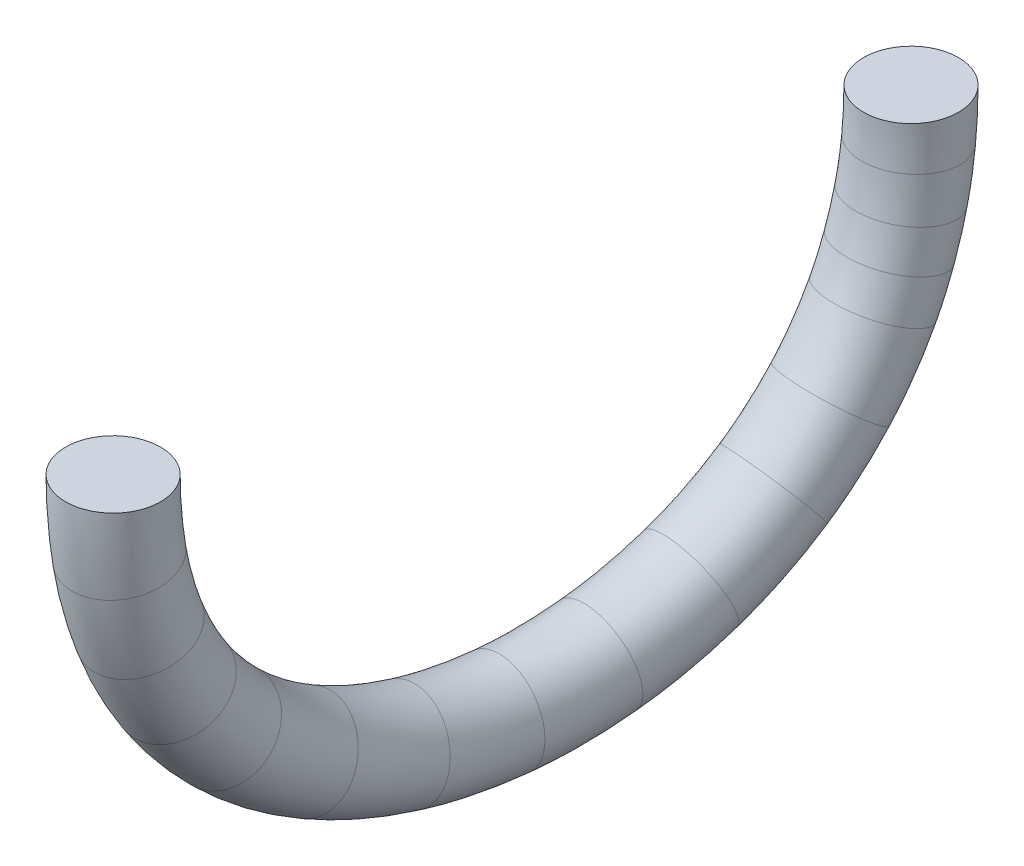
ISO-10303-21;
HEADER;
FILE_DESCRIPTION(('STEP AP214'),'2;1');
FILE_NAME('part.step','',(''),(''),'','','');
FILE_SCHEMA(('AUTOMOTIVE_DESIGN { 1 0 10303 214 1 1 1 1 }'));
ENDSEC;
DATA;
#1=APPLICATION_CONTEXT('core data for automotive mechanical design processes');
#2=APPLICATION_PROTOCOL_DEFINITION('international standard','automotive_design',2000,#1);
#3=PRODUCT_CONTEXT('',#1,'mechanical');
#4=PRODUCT('Part','Part','',(#3));
#5=PRODUCT_RELATED_PRODUCT_CATEGORY('part','',(#4));
#6=PRODUCT_DEFINITION_FORMATION('','',#4);
#7=PRODUCT_DEFINITION_CONTEXT('part definition',#1,'design');
#8=PRODUCT_DEFINITION('design','',#6,#7);
#9=PRODUCT_DEFINITION_SHAPE('','',#8);
#10=(LENGTH_UNIT() NAMED_UNIT(*) SI_UNIT(.MILLI.,.METRE.));
#11=(NAMED_UNIT(*) PLANE_ANGLE_UNIT() SI_UNIT($,.RADIAN.));
#12=(NAMED_UNIT(*) SI_UNIT($,.STERADIAN.) SOLID_ANGLE_UNIT());
#13=UNCERTAINTY_MEASURE_WITH_UNIT(LENGTH_MEASURE(1.E-05),#10,'distance_accuracy_value','');
#14=(GEOMETRIC_REPRESENTATION_CONTEXT(3) GLOBAL_UNCERTAINTY_ASSIGNED_CONTEXT((#13)) GLOBAL_UNIT_ASSIGNED_CONTEXT((#10,
#11,#12)) REPRESENTATION_CONTEXT('',''));
#15=CARTESIAN_POINT('',(0.,0.,0.));
#16=DIRECTION('',(0.,0.,1.));
#17=DIRECTION('',(1.,0.,0.));
#18=AXIS2_PLACEMENT_3D('',#15,#16,#17);
#19=CARTESIAN_POINT('',(3.74968353162511,-227.95,220.010489149716));
#20=DIRECTION('',(0.,-1.,0.));
#21=DIRECTION('',(0.,0.,-1.));
#22=AXIS2_PLACEMENT_3D('',#19,#20,#21);
#23=PLANE('',#22);
#24=CARTESIAN_POINT('',(3.74968353162511,-227.95,220.010489149716));
#25=DIRECTION('',(0.,1.,0.));
#26=DIRECTION('',(0.,0.,-1.));
#27=AXIS2_PLACEMENT_3D('',#24,#25,#26);
#28=CIRCLE('',#27,0.77);
#29=CARTESIAN_POINT('',(3.74968353162511,-227.95,219.240489149716));
#30=VERTEX_POINT('',#29);
#31=EDGE_CURVE('E11',#30,#30,#28,.T.);
#32=ORIENTED_EDGE('',*,*,#31,.T.);
#33=EDGE_LOOP('',(#32));
#34=FACE_BOUND('',#33,.T.);
#35=ADVANCED_FACE('F43',(#34),#23,.F.);
#36=CARTESIAN_POINT('',(4.74999999999809,-227.95,208.06048914986));
#37=DIRECTION('',(0.,1.,-2.82315837374369E-13));
#38=DIRECTION('',(0.,-2.82315837374369E-13,-1.));
#39=AXIS2_PLACEMENT_3D('',#36,#37,#38);
#40=PLANE('',#39);
#41=CARTESIAN_POINT('',(4.74999999999809,-227.95,208.06048914986));
#42=DIRECTION('',(0.,-1.,2.89288795888391E-13));
#43=DIRECTION('',(-0.166252035609427,2.88369616785754E-13,0.986083292960448));
#44=AXIS2_PLACEMENT_3D('',#41,#42,#43);
#45=CIRCLE('',#44,0.77);
#46=CARTESIAN_POINT('',(4.62198593257883,-227.95,208.81977328544));
#47=VERTEX_POINT('',#46);
#48=EDGE_CURVE('E47',#47,#47,#45,.T.);
#49=ORIENTED_EDGE('',*,*,#48,.F.);
#50=EDGE_LOOP('',(#49));
#51=FACE_BOUND('',#50,.T.);
#52=ADVANCED_FACE('F141',(#51),#40,.T.);
#53=CARTESIAN_POINT('',(4.3732439219378,-227.95,212.561299918366));
#54=DIRECTION('',(0.996514749755478,0.,0.0834167460392471));
#55=DIRECTION('',(-0.0834167460392471,0.,0.996514749755478));
#56=AXIS2_PLACEMENT_3D('',#53,#54,#55);
#57=TOROIDAL_SURFACE('',#56,7.47524232147945,0.77);
#58=ORIENTED_EDGE('',*,*,#31,.F.);
#59=EDGE_LOOP('',(#58));
#60=FACE_BOUND('',#59,.T.);
#61=CARTESIAN_POINT('',(3.7575961332009,-229.137076042113,219.915963475273));
#62=DIRECTION('',(-0.0132466636498901,0.987310609046535,0.158247550269526));
#63=DIRECTION('',(-0.00105481853832837,0.158247550269526,-0.98739890631474));
#64=AXIS2_PLACEMENT_3D('',#61,#62,#63);
#65=CIRCLE('',#64,0.77);
#66=CARTESIAN_POINT('',(3.75678392292638,-229.015225428405,219.155666317411));
#67=VERTEX_POINT('',#66);
#68=EDGE_CURVE('E53',#67,#67,#65,.T.);
#69=ORIENTED_EDGE('',*,*,#68,.T.);
#70=EDGE_LOOP('',(#69));
#71=FACE_BOUND('',#70,.T.);
#72=ADVANCED_FACE('F143',(#60,#71),#57,.T.);
#73=CARTESIAN_POINT('',(4.25170299875594,-228.184352044603,214.013254452683));
#74=DIRECTION('',(-0.996514749755477,0.,-0.0834167460392616));
#75=DIRECTION('',(0.0834167460392616,0.,-0.996514749755477));
#76=AXIS2_PLACEMENT_3D('',#73,#74,#75);
#77=TOROIDAL_SURFACE('',#76,5.9994831790234,0.77);
#78=CARTESIAN_POINT('',(3.78296585064502,-230.286291976218,219.612891264588));
#79=DIRECTION('',(-0.0292253489564323,0.936617544595879,0.349132430652841));
#80=DIRECTION('',(-0.00526873111642949,0.349132430652841,-0.937058582127533));
#81=AXIS2_PLACEMENT_3D('',#78,#79,#80);
#82=CIRCLE('',#81,0.77);
#83=CARTESIAN_POINT('',(3.77890892768537,-230.017460004615,218.89135615635));
#84=VERTEX_POINT('',#83);
#85=EDGE_CURVE('E115',#84,#84,#82,.T.);
#86=ORIENTED_EDGE('',*,*,#85,.T.);
#87=EDGE_LOOP('',(#86));
#88=FACE_BOUND('',#87,.T.);
#89=ORIENTED_EDGE('',*,*,#68,.F.);
#90=EDGE_LOOP('',(#89));
#91=FACE_BOUND('',#90,.T.);
#92=ADVANCED_FACE('F150',(#88,#91),#77,.T.);
#93=CARTESIAN_POINT('',(4.21673324256715,-228.341165574805,214.431010832452));
#94=DIRECTION('',(-0.996514749755478,0.,-0.0834167460392495));
#95=DIRECTION('',(0.0834167460392495,0.,-0.996514749755478));
#96=AXIS2_PLACEMENT_3D('',#93,#94,#95);
#97=TOROIDAL_SURFACE('',#96,5.55189658411758,0.77);
#98=CARTESIAN_POINT('',(3.82754635117133,-231.35048231554,219.080322824373));
#99=DIRECTION('',(-0.0452147129382194,0.84035655375753,0.540144880833543));
#100=DIRECTION('',(-0.0132705239547579,0.540144880833543,-0.841467409293601));
#101=AXIS2_PLACEMENT_3D('',#98,#99,#100);
#102=CIRCLE('',#101,0.77);
#103=CARTESIAN_POINT('',(3.81732804772616,-230.934570757298,218.432392919217));
#104=VERTEX_POINT('',#103);
#105=EDGE_CURVE('E131',#104,#104,#102,.T.);
#106=ORIENTED_EDGE('',*,*,#105,.T.);
#107=EDGE_LOOP('',(#106));
#108=FACE_BOUND('',#107,.T.);
#109=ORIENTED_EDGE('',*,*,#85,.F.);
#110=EDGE_LOOP('',(#109));
#111=FACE_BOUND('',#110,.T.);
#112=ADVANCED_FACE('F188',(#108,#111),#97,.T.);
#113=CARTESIAN_POINT('',(4.20066928500365,-228.465377200342,214.622914393926));
#114=DIRECTION('',(-0.996514749755477,0.,-0.0834167460392619));
#115=DIRECTION('',(0.0834167460392619,0.,-0.996514749755477));
#116=AXIS2_PLACEMENT_3D('',#113,#114,#115);
#117=TOROIDAL_SURFACE('',#116,5.32273822062666,0.77);
#118=CARTESIAN_POINT('',(3.89035430315417,-232.272308269116,218.330005249969));
#119=DIRECTION('',(-0.0596613601852873,0.698898955494254,0.712727698430391));
#120=DIRECTION('',(-0.0250293307866029,0.712727698430391,-0.7009941230071));
#121=AXIS2_PLACEMENT_3D('',#118,#119,#120);
#122=CIRCLE('',#121,0.77);
#123=CARTESIAN_POINT('',(3.87108171844849,-231.723507941325,217.790239775254));
#124=VERTEX_POINT('',#123);
#125=EDGE_CURVE('E126',#124,#124,#122,.T.);
#126=ORIENTED_EDGE('',*,*,#125,.T.);
#127=EDGE_LOOP('',(#126));
#128=FACE_BOUND('',#127,.T.);
#129=ORIENTED_EDGE('',*,*,#105,.F.);
#130=EDGE_LOOP('',(#129));
#131=FACE_BOUND('',#130,.T.);
#132=ADVANCED_FACE('F156',(#128,#131),#117,.T.);
#133=CARTESIAN_POINT('',(4.21270504697046,-228.317722981733,214.479132540832));
#134=DIRECTION('',(-0.996514749755479,0.,-0.0834167460392381));
#135=DIRECTION('',(0.0834167460392381,0.,-0.996514749755479));
#136=AXIS2_PLACEMENT_3D('',#133,#134,#135);
#137=TOROIDAL_SURFACE('',#136,5.52918397407938,0.77);
#138=CARTESIAN_POINT('',(3.99476480645106,-233.190693610801,217.08269447));
#139=DIRECTION('',(-0.073516698906624,0.472523204556341,0.878246614646296));
#140=DIRECTION('',(-0.0438470454896238,0.878246614646296,-0.476193574572517));
#141=AXIS2_PLACEMENT_3D('',#138,#139,#140);
#142=CIRCLE('',#141,0.77);
#143=CARTESIAN_POINT('',(3.96100258142405,-232.514443717523,216.716025417579));
#144=VERTEX_POINT('',#143);
#145=EDGE_CURVE('E124',#144,#144,#142,.T.);
#146=ORIENTED_EDGE('',*,*,#145,.T.);
#147=EDGE_LOOP('',(#146));
#148=FACE_BOUND('',#147,.T.);
#149=ORIENTED_EDGE('',*,*,#125,.F.);
#150=EDGE_LOOP('',(#149));
#151=FACE_BOUND('',#150,.T.);
#152=ADVANCED_FACE('F162',(#148,#151),#137,.T.);
#153=CARTESIAN_POINT('',(4.24242309813352,-227.653250968096,214.124114181522));
#154=DIRECTION('',(-0.996514749755478,0.,-0.0834167460392497));
#155=DIRECTION('',(0.0834167460392496,0.,-0.996514749755478));
#156=AXIS2_PLACEMENT_3D('',#153,#154,#155);
#157=TOROIDAL_SURFACE('',#156,6.28313639626421,0.77);
#158=CARTESIAN_POINT('',(4.11586409549657,-233.750458468844,215.636015793971));
#159=DIRECTION('',(-0.0809482999511162,0.241470071868795,0.967026151211384));
#160=DIRECTION('',(-0.063053572311243,0.967026151211385,-0.246748191264063));
#161=AXIS2_PLACEMENT_3D('',#158,#159,#160);
#162=CIRCLE('',#161,0.77);
#163=CARTESIAN_POINT('',(4.06731284481691,-233.005848332412,215.446019686697));
#164=VERTEX_POINT('',#163);
#165=EDGE_CURVE('E122',#164,#164,#162,.T.);
#166=ORIENTED_EDGE('',*,*,#165,.T.);
#167=EDGE_LOOP('',(#166));
#168=FACE_BOUND('',#167,.T.);
#169=ORIENTED_EDGE('',*,*,#145,.F.);
#170=EDGE_LOOP('',(#169));
#171=FACE_BOUND('',#170,.T.);
#172=ADVANCED_FACE('F158',(#168,#171),#157,.T.);
#173=CARTESIAN_POINT('',(4.24947775262105,-227.313380304133,214.039837731228));
#174=DIRECTION('',(-0.996514749755478,0.,-0.0834167460392477));
#175=DIRECTION('',(0.0834167460392477,0.,-0.996514749755478));
#176=AXIS2_PLACEMENT_3D('',#173,#174,#175);
#177=TOROIDAL_SURFACE('',#176,6.63337111248515,0.77);
#178=CARTESIAN_POINT('',(4.2367251969892,-233.944989516218,214.192182558705));
#179=DIRECTION('',(-0.0833945895828081,0.0230467497949795,0.996250063865595));
#180=DIRECTION('',(-0.0812102332709189,0.996250063865596,-0.0298447358822016));
#181=AXIS2_PLACEMENT_3D('',#178,#179,#180);
#182=CIRCLE('',#181,0.77);
#183=CARTESIAN_POINT('',(4.17419331737059,-233.177876967042,214.169202112076));
#184=VERTEX_POINT('',#183);
#185=EDGE_CURVE('E120',#184,#184,#182,.T.);
#186=ORIENTED_EDGE('',*,*,#185,.T.);
#187=EDGE_LOOP('',(#186));
#188=FACE_BOUND('',#187,.T.);
#189=ORIENTED_EDGE('',*,*,#165,.F.);
#190=EDGE_LOOP('',(#189));
#191=FACE_BOUND('',#190,.T.);
#192=ADVANCED_FACE('F161',(#188,#191),#177,.T.);
#193=CARTESIAN_POINT('',(4.2496025145345,-227.248501367006,214.038347298034));
#194=DIRECTION('',(-0.996514749755478,0.,-0.0834167460392469));
#195=DIRECTION('',(0.0834167460392469,0.,-0.996514749755478));
#196=AXIS2_PLACEMENT_3D('',#193,#194,#195);
#197=TOROIDAL_SURFACE('',#196,6.69826728678982,0.77);
#198=CARTESIAN_POINT('',(4.35823112334135,-233.818962239892,212.740646104195));
#199=DIRECTION('',(-0.0818251112605453,-0.19441443133782,0.977500731485553));
#200=DIRECTION('',(-0.0992869152855957,0.977500731485554,0.186103273475449));
#201=AXIS2_PLACEMENT_3D('',#198,#199,#200);
#202=CIRCLE('',#201,0.77);
#203=CARTESIAN_POINT('',(4.28178019857144,-233.066286676649,212.883945624771));
#204=VERTEX_POINT('',#203);
#205=EDGE_CURVE('E123',#204,#204,#202,.T.);
#206=ORIENTED_EDGE('',*,*,#205,.T.);
#207=EDGE_LOOP('',(#206));
#208=FACE_BOUND('',#207,.T.);
#209=ORIENTED_EDGE('',*,*,#185,.F.);
#210=EDGE_LOOP('',(#209));
#211=FACE_BOUND('',#210,.T.);
#212=ADVANCED_FACE('F192',(#208,#211),#197,.T.);
#213=CARTESIAN_POINT('',(4.25416767436395,-227.524627558507,213.98381089712));
#214=DIRECTION('',(-0.996514749755478,0.,-0.0834167460392473));
#215=DIRECTION('',(0.0834167460392473,0.,-0.996514749755478));
#216=AXIS2_PLACEMENT_3D('',#213,#214,#215);
#217=TOROIDAL_SURFACE('',#216,6.41676998068925,0.77);
#218=CARTESIAN_POINT('',(4.47402926404181,-233.375099157973,211.357296109364));
#219=DIRECTION('',(-0.0760549786093626,-0.410751962867887,0.908569460871819));
#220=DIRECTION('',(-0.117270192783391,0.90856946087182,0.400935451981534));
#221=AXIS2_PLACEMENT_3D('',#218,#219,#220);
#222=CIRCLE('',#221,0.77);
#223=CARTESIAN_POINT('',(4.38373121559859,-232.675500673102,211.66601640739));
#224=VERTEX_POINT('',#223);
#225=EDGE_CURVE('E119',#224,#224,#222,.T.);
#226=ORIENTED_EDGE('',*,*,#225,.T.);
#227=EDGE_LOOP('',(#226));
#228=FACE_BOUND('',#227,.T.);
#229=ORIENTED_EDGE('',*,*,#205,.F.);
#230=EDGE_LOOP('',(#229));
#231=FACE_BOUND('',#230,.T.);
#232=ADVANCED_FACE('F194',(#228,#231),#217,.T.);
#233=CARTESIAN_POINT('',(4.27924474623851,-228.191923274028,213.684234694618));
#234=DIRECTION('',(-0.996514749755479,0.,-0.0834167460392349));
#235=DIRECTION('',(0.083416746039235,0.,-0.996514749755479));
#236=AXIS2_PLACEMENT_3D('',#233,#234,#235);
#237=TOROIDAL_SURFACE('',#236,5.68488315023477,0.77);
#238=CARTESIAN_POINT('',(4.57739004078943,-232.612696293653,210.12252559306));
#239=DIRECTION('',(-0.0648679120625618,-0.628714059709328,0.774926309469784));
#240=DIRECTION('',(-0.135388513926188,0.774926309469786,0.61738089149924));
#241=AXIS2_PLACEMENT_3D('',#238,#239,#240);
#242=CIRCLE('',#241,0.77);
#243=CARTESIAN_POINT('',(4.47314088506627,-232.016003035362,210.597908879515));
#244=VERTEX_POINT('',#243);
#245=EDGE_CURVE('E117',#244,#244,#242,.T.);
#246=ORIENTED_EDGE('',*,*,#245,.T.);
#247=EDGE_LOOP('',(#246));
#248=FACE_BOUND('',#247,.T.);
#249=ORIENTED_EDGE('',*,*,#225,.F.);
#250=EDGE_LOOP('',(#249));
#251=FACE_BOUND('',#250,.T.);
#252=ADVANCED_FACE('F167',(#248,#251),#237,.T.);
#253=CARTESIAN_POINT('',(4.29454087064093,-228.418727772705,213.501503836546));
#254=DIRECTION('',(-0.996514749755478,0.,-0.0834167460392526));
#255=DIRECTION('',(0.0834167460392526,0.,-0.996514749755478));
#256=AXIS2_PLACEMENT_3D('',#253,#254,#255);
#257=TOROIDAL_SURFACE('',#256,5.39322441380947,0.77);
#258=CARTESIAN_POINT('',(4.64889622768648,-231.741567176539,209.268296995985));
#259=DIRECTION('',(-0.051394199353021,-0.787657234387214,0.613966381319326));
#260=DIRECTION('',(-0.148600827094397,0.613966381319328,0.775218083378162));
#261=AXIS2_PLACEMENT_3D('',#258,#259,#260);
#262=CIRCLE('',#261,0.77);
#263=CARTESIAN_POINT('',(4.53447359082379,-231.268813062923,209.865214920186));
#264=VERTEX_POINT('',#263);
#265=EDGE_CURVE('E110',#264,#264,#262,.T.);
#266=ORIENTED_EDGE('',*,*,#265,.T.);
#267=EDGE_LOOP('',(#266));
#268=FACE_BOUND('',#267,.T.);
#269=ORIENTED_EDGE('',*,*,#245,.F.);
#270=EDGE_LOOP('',(#269));
#271=FACE_BOUND('',#270,.T.);
#272=ADVANCED_FACE('F164',(#268,#271),#257,.T.);
#273=CARTESIAN_POINT('',(4.29356350556372,-228.409562884618,213.513179654193));
#274=DIRECTION('',(-0.996514749755479,0.,-0.0834167460392397));
#275=DIRECTION('',(0.0834167460392397,0.,-0.996514749755479));
#276=AXIS2_PLACEMENT_3D('',#273,#274,#275);
#277=TOROIDAL_SURFACE('',#276,5.40809973343169,0.77);
#278=CARTESIAN_POINT('',(4.70223414338218,-230.699962920773,208.631110552786));
#279=DIRECTION('',(-0.0353280685567408,-0.905890069556209,0.422036857930083));
#280=DIRECTION('',(-0.158429051855757,0.422036857930085,0.892628212682406));
#281=AXIS2_PLACEMENT_3D('',#278,#279,#280);
#282=CIRCLE('',#281,0.77);
#283=CARTESIAN_POINT('',(4.58024377345325,-230.374994540166,209.318434276551));
#284=VERTEX_POINT('',#283);
#285=EDGE_CURVE('E107',#284,#284,#282,.T.);
#286=ORIENTED_EDGE('',*,*,#285,.T.);
#287=EDGE_LOOP('',(#286));
#288=FACE_BOUND('',#287,.T.);
#289=ORIENTED_EDGE('',*,*,#265,.F.);
#290=EDGE_LOOP('',(#289));
#291=FACE_BOUND('',#290,.T.);
#292=ADVANCED_FACE('F166',(#288,#291),#277,.T.);
#293=CARTESIAN_POINT('',(4.27550975304697,-228.308380388027,213.728853742733));
#294=DIRECTION('',(-0.996514749755474,0.,-0.0834167460393025));
#295=DIRECTION('',(0.0834167460393026,0.,-0.996514749755474));
#296=AXIS2_PLACEMENT_3D('',#293,#294,#295);
#297=TOROIDAL_SURFACE('',#296,5.64701216103623,0.77);
#298=CARTESIAN_POINT('',(4.72286825435648,-230.076906763475,208.384610935979));
#299=DIRECTION('',(-0.0261243842437958,-0.949694071973423,0.312087625846367));
#300=DIRECTION('',(-0.162070304140605,0.312087625846368,0.936127411365221));
#301=AXIS2_PLACEMENT_3D('',#298,#299,#300);
#302=CIRCLE('',#301,0.77);
#303=CARTESIAN_POINT('',(4.59807412016821,-229.836599291573,209.10542904273));
#304=VERTEX_POINT('',#303);
#305=EDGE_CURVE('E104',#304,#304,#302,.T.);
#306=ORIENTED_EDGE('',*,*,#305,.T.);
#307=EDGE_LOOP('',(#306));
#308=FACE_BOUND('',#307,.T.);
#309=ORIENTED_EDGE('',*,*,#285,.F.);
#310=EDGE_LOOP('',(#309));
#311=FACE_BOUND('',#310,.T.);
#312=ADVANCED_FACE('F45',(#308,#311),#297,.T.);
#313=CARTESIAN_POINT('',(4.23271258639948,-228.139191878619,214.240118085173));
#314=DIRECTION('',(-0.996514749755476,0.,-0.0834167460392753));
#315=DIRECTION('',(0.0834167460392753,0.,-0.996514749755476));
#316=AXIS2_PLACEMENT_3D('',#313,#314,#315);
#317=TOROIDAL_SURFACE('',#316,6.18724135039759,0.77);
#318=CARTESIAN_POINT('',(4.73748186499241,-229.429635153873,208.210033537107));
#319=DIRECTION('',(-0.0173978309353366,-0.978008463295209,0.207838305424406));
#320=DIRECTION('',(-0.164423966737754,0.207838305424406,0.964244781142493));
#321=AXIS2_PLACEMENT_3D('',#318,#319,#320);
#322=CIRCLE('',#321,0.77);
#323=CARTESIAN_POINT('',(4.61087541060434,-229.269599658697,208.952502018587));
#324=VERTEX_POINT('',#323);
#325=EDGE_CURVE('E108',#324,#324,#322,.T.);
#326=ORIENTED_EDGE('',*,*,#325,.T.);
#327=EDGE_LOOP('',(#326));
#328=FACE_BOUND('',#327,.T.);
#329=ORIENTED_EDGE('',*,*,#305,.F.);
#330=EDGE_LOOP('',(#329));
#331=FACE_BOUND('',#330,.T.);
#332=ADVANCED_FACE('F175',(#328,#331),#317,.T.);
#333=CARTESIAN_POINT('',(4.19964072708291,-228.054643630011,214.635201772509));
#334=DIRECTION('',(-0.996514749755476,0.,-0.0834167460392736));
#335=DIRECTION('',(0.0834167460392736,0.,-0.996514749755476));
#336=AXIS2_PLACEMENT_3D('',#333,#334,#335);
#337=TOROIDAL_SURFACE('',#336,6.59262175720164,0.77);
#338=CARTESIAN_POINT('',(4.74698421092692,-228.693917207342,208.096516427766));
#339=DIRECTION('',(-0.00808875795002068,-0.995287496247724,0.0966300771383421));
#340=DIRECTION('',(-0.165860303938611,0.0966300771383413,0.981403580475244));
#341=AXIS2_PLACEMENT_3D('',#338,#339,#340);
#342=CIRCLE('',#341,0.77);
#343=CARTESIAN_POINT('',(4.61927177689419,-228.619512047945,208.852197184732));
#344=VERTEX_POINT('',#343);
#345=EDGE_CURVE('E133',#344,#344,#342,.T.);
#346=ORIENTED_EDGE('',*,*,#345,.T.);
#347=EDGE_LOOP('',(#346));
#348=FACE_BOUND('',#347,.T.);
#349=ORIENTED_EDGE('',*,*,#325,.F.);
#350=EDGE_LOOP('',(#349));
#351=FACE_BOUND('',#350,.T.);
#352=ADVANCED_FACE('F170',(#348,#351),#337,.T.);
#353=CARTESIAN_POINT('',(4.11004526898538,-227.95,215.705528772117));
#354=DIRECTION('',(-0.996514749755476,0.,-0.0834167460392789));
#355=DIRECTION('',(0.0834167460392789,0.,-0.996514749755476));
#356=AXIS2_PLACEMENT_3D('',#353,#354,#355);
#357=TOROIDAL_SURFACE('',#356,7.6717776873168,0.77);
#358=ORIENTED_EDGE('',*,*,#48,.T.);
#359=EDGE_LOOP('',(#358));
#360=FACE_BOUND('',#359,.T.);
#361=ORIENTED_EDGE('',*,*,#345,.F.);
#362=EDGE_LOOP('',(#361));
#363=FACE_BOUND('',#362,.T.);
#364=ADVANCED_FACE('F138',(#360,#363),#357,.T.);
#365=CLOSED_SHELL('',(#35,#52,#72,#92,#112,#132,#152,#172,#192,#212,#232,#252,#272,#292,#312,
#332,#352,#364));
#366=MANIFOLD_SOLID_BREP('B2',#365);
#367=ADVANCED_BREP_SHAPE_REPRESENTATION('',(#18,#366),#14);
#368=SHAPE_DEFINITION_REPRESENTATION(#9,#367);
ENDSEC;
END-ISO-10303-21;
